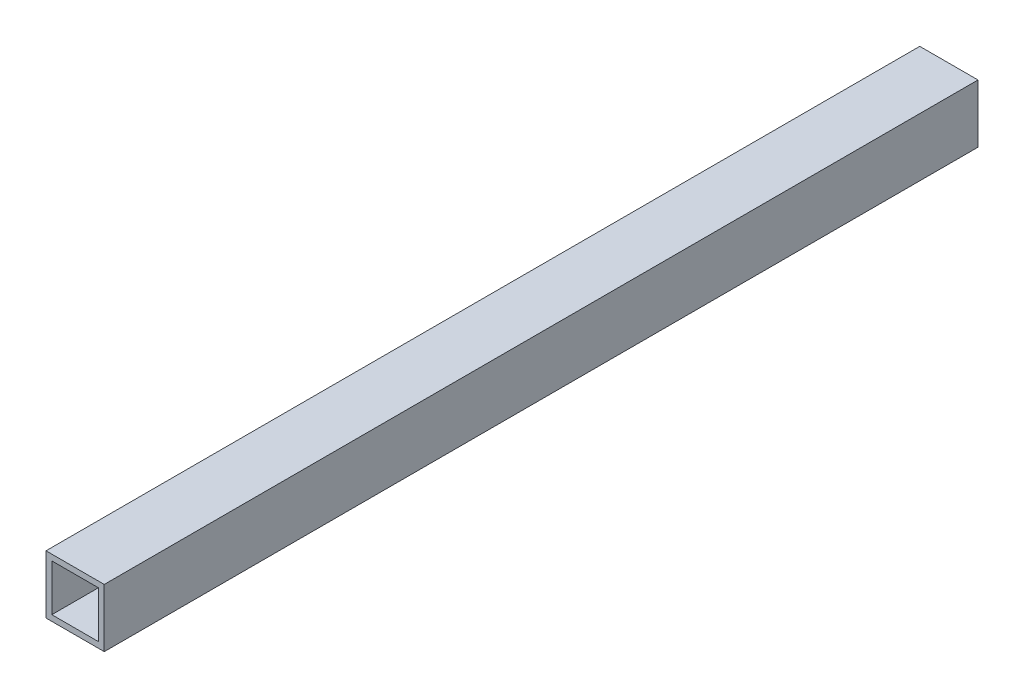
ISO-10303-21;
HEADER;
FILE_DESCRIPTION(('STEP AP214'),'2;1');
FILE_NAME('part.step','',(''),(''),'','','');
FILE_SCHEMA(('AUTOMOTIVE_DESIGN { 1 0 10303 214 1 1 1 1 }'));
ENDSEC;
DATA;
#1=APPLICATION_CONTEXT('core data for automotive mechanical design processes');
#2=APPLICATION_PROTOCOL_DEFINITION('international standard','automotive_design',2000,#1);
#3=PRODUCT_CONTEXT('',#1,'mechanical');
#4=PRODUCT('Part','Part','',(#3));
#5=PRODUCT_RELATED_PRODUCT_CATEGORY('part','',(#4));
#6=PRODUCT_DEFINITION_FORMATION('','',#4);
#7=PRODUCT_DEFINITION_CONTEXT('part definition',#1,'design');
#8=PRODUCT_DEFINITION('design','',#6,#7);
#9=PRODUCT_DEFINITION_SHAPE('','',#8);
#10=(LENGTH_UNIT() NAMED_UNIT(*) SI_UNIT(.MILLI.,.METRE.));
#11=(NAMED_UNIT(*) PLANE_ANGLE_UNIT() SI_UNIT($,.RADIAN.));
#12=(NAMED_UNIT(*) SI_UNIT($,.STERADIAN.) SOLID_ANGLE_UNIT());
#13=UNCERTAINTY_MEASURE_WITH_UNIT(LENGTH_MEASURE(1.E-05),#10,'distance_accuracy_value','');
#14=(GEOMETRIC_REPRESENTATION_CONTEXT(3) GLOBAL_UNCERTAINTY_ASSIGNED_CONTEXT((#13)) GLOBAL_UNIT_ASSIGNED_CONTEXT((#10,
#11,#12)) REPRESENTATION_CONTEXT('',''));
#15=CARTESIAN_POINT('',(0.,0.,0.));
#16=DIRECTION('',(0.,0.,1.));
#17=DIRECTION('',(1.,0.,0.));
#18=AXIS2_PLACEMENT_3D('',#15,#16,#17);
#19=CARTESIAN_POINT('',(0.,0.,150.));
#20=DIRECTION('',(0.,0.,1.));
#21=DIRECTION('',(1.,0.,0.));
#22=AXIS2_PLACEMENT_3D('',#19,#20,#21);
#23=PLANE('',#22);
#24=DIRECTION('',(0.,1.,0.));
#25=VECTOR('',#24,1.);
#26=CARTESIAN_POINT('',(5.,5.,150.));
#27=LINE('',#26,#25);
#28=CARTESIAN_POINT('',(5.,-5.,150.));
#29=VERTEX_POINT('',#28);
#30=CARTESIAN_POINT('',(5.,5.,150.));
#31=VERTEX_POINT('',#30);
#32=EDGE_CURVE('E153',#29,#31,#27,.T.);
#33=ORIENTED_EDGE('',*,*,#32,.T.);
#34=DIRECTION('',(-1.,0.,0.));
#35=VECTOR('',#34,1.);
#36=CARTESIAN_POINT('',(-5.,5.,150.));
#37=LINE('',#36,#35);
#38=CARTESIAN_POINT('',(-5.,5.,150.));
#39=VERTEX_POINT('',#38);
#40=EDGE_CURVE('E157',#31,#39,#37,.T.);
#41=ORIENTED_EDGE('',*,*,#40,.T.);
#42=DIRECTION('',(0.,-1.,0.));
#43=VECTOR('',#42,1.);
#44=CARTESIAN_POINT('',(-5.,5.,150.));
#45=LINE('',#44,#43);
#46=CARTESIAN_POINT('',(-5.,-5.,150.));
#47=VERTEX_POINT('',#46);
#48=EDGE_CURVE('E161',#39,#47,#45,.T.);
#49=ORIENTED_EDGE('',*,*,#48,.T.);
#50=DIRECTION('',(1.,0.,0.));
#51=VECTOR('',#50,1.);
#52=CARTESIAN_POINT('',(-5.,-5.,150.));
#53=LINE('',#52,#51);
#54=EDGE_CURVE('E164',#47,#29,#53,.T.);
#55=ORIENTED_EDGE('',*,*,#54,.T.);
#56=EDGE_LOOP('',(#33,#41,#49,#55));
#57=FACE_BOUND('',#56,.T.);
#58=DIRECTION('',(-1.,0.,0.));
#59=VECTOR('',#58,1.);
#60=CARTESIAN_POINT('',(-4.,4.,150.));
#61=LINE('',#60,#59);
#62=CARTESIAN_POINT('',(4.,4.,150.));
#63=VERTEX_POINT('',#62);
#64=CARTESIAN_POINT('',(-4.,4.,150.));
#65=VERTEX_POINT('',#64);
#66=EDGE_CURVE('E114',#63,#65,#61,.T.);
#67=ORIENTED_EDGE('',*,*,#66,.F.);
#68=DIRECTION('',(0.,1.,0.));
#69=VECTOR('',#68,1.);
#70=CARTESIAN_POINT('',(4.,4.,150.));
#71=LINE('',#70,#69);
#72=CARTESIAN_POINT('',(4.,-4.,150.));
#73=VERTEX_POINT('',#72);
#74=EDGE_CURVE('E105',#73,#63,#71,.T.);
#75=ORIENTED_EDGE('',*,*,#74,.F.);
#76=DIRECTION('',(1.,0.,0.));
#77=VECTOR('',#76,1.);
#78=CARTESIAN_POINT('',(-4.,-4.,150.));
#79=LINE('',#78,#77);
#80=CARTESIAN_POINT('',(-4.,-4.,150.));
#81=VERTEX_POINT('',#80);
#82=EDGE_CURVE('E131',#81,#73,#79,.T.);
#83=ORIENTED_EDGE('',*,*,#82,.F.);
#84=DIRECTION('',(0.,-1.,0.));
#85=VECTOR('',#84,1.);
#86=CARTESIAN_POINT('',(-4.,4.,150.));
#87=LINE('',#86,#85);
#88=EDGE_CURVE('E127',#65,#81,#87,.T.);
#89=ORIENTED_EDGE('',*,*,#88,.F.);
#90=EDGE_LOOP('',(#67,#75,#83,#89));
#91=FACE_BOUND('',#90,.T.);
#92=ADVANCED_FACE('F39',(#57,#91),#23,.T.);
#93=CARTESIAN_POINT('',(0.,0.,0.));
#94=DIRECTION('',(0.,0.,1.));
#95=DIRECTION('',(1.,0.,0.));
#96=AXIS2_PLACEMENT_3D('',#93,#94,#95);
#97=PLANE('',#96);
#98=DIRECTION('',(0.,1.,0.));
#99=VECTOR('',#98,1.);
#100=CARTESIAN_POINT('',(5.,5.,0.));
#101=LINE('',#100,#99);
#102=CARTESIAN_POINT('',(5.,-5.,0.));
#103=VERTEX_POINT('',#102);
#104=CARTESIAN_POINT('',(5.,5.,0.));
#105=VERTEX_POINT('',#104);
#106=EDGE_CURVE('E123',#103,#105,#101,.T.);
#107=ORIENTED_EDGE('',*,*,#106,.F.);
#108=DIRECTION('',(1.,0.,0.));
#109=VECTOR('',#108,1.);
#110=CARTESIAN_POINT('',(-5.,-5.,0.));
#111=LINE('',#110,#109);
#112=CARTESIAN_POINT('',(-5.,-5.,0.));
#113=VERTEX_POINT('',#112);
#114=EDGE_CURVE('E158',#113,#103,#111,.T.);
#115=ORIENTED_EDGE('',*,*,#114,.F.);
#116=DIRECTION('',(0.,-1.,0.));
#117=VECTOR('',#116,1.);
#118=CARTESIAN_POINT('',(-5.,5.,0.));
#119=LINE('',#118,#117);
#120=CARTESIAN_POINT('',(-5.,5.,0.));
#121=VERTEX_POINT('',#120);
#122=EDGE_CURVE('E174',#121,#113,#119,.T.);
#123=ORIENTED_EDGE('',*,*,#122,.F.);
#124=DIRECTION('',(-1.,0.,0.));
#125=VECTOR('',#124,1.);
#126=CARTESIAN_POINT('',(-5.,5.,0.));
#127=LINE('',#126,#125);
#128=EDGE_CURVE('E171',#105,#121,#127,.T.);
#129=ORIENTED_EDGE('',*,*,#128,.F.);
#130=EDGE_LOOP('',(#107,#115,#123,#129));
#131=FACE_BOUND('',#130,.T.);
#132=DIRECTION('',(0.,1.,0.));
#133=VECTOR('',#132,1.);
#134=CARTESIAN_POINT('',(4.,4.,0.));
#135=LINE('',#134,#133);
#136=CARTESIAN_POINT('',(4.,-4.,0.));
#137=VERTEX_POINT('',#136);
#138=CARTESIAN_POINT('',(4.,4.,0.));
#139=VERTEX_POINT('',#138);
#140=EDGE_CURVE('E63',#137,#139,#135,.T.);
#141=ORIENTED_EDGE('',*,*,#140,.T.);
#142=DIRECTION('',(-1.,0.,0.));
#143=VECTOR('',#142,1.);
#144=CARTESIAN_POINT('',(-4.,4.,0.));
#145=LINE('',#144,#143);
#146=CARTESIAN_POINT('',(-4.,4.,0.));
#147=VERTEX_POINT('',#146);
#148=EDGE_CURVE('E121',#139,#147,#145,.T.);
#149=ORIENTED_EDGE('',*,*,#148,.T.);
#150=DIRECTION('',(0.,-1.,0.));
#151=VECTOR('',#150,1.);
#152=CARTESIAN_POINT('',(-4.,4.,0.));
#153=LINE('',#152,#151);
#154=CARTESIAN_POINT('',(-4.,-4.,0.));
#155=VERTEX_POINT('',#154);
#156=EDGE_CURVE('E140',#147,#155,#153,.T.);
#157=ORIENTED_EDGE('',*,*,#156,.T.);
#158=DIRECTION('',(1.,0.,0.));
#159=VECTOR('',#158,1.);
#160=CARTESIAN_POINT('',(-4.,-4.,0.));
#161=LINE('',#160,#159);
#162=EDGE_CURVE('E115',#155,#137,#161,.T.);
#163=ORIENTED_EDGE('',*,*,#162,.T.);
#164=EDGE_LOOP('',(#141,#149,#157,#163));
#165=FACE_BOUND('',#164,.T.);
#166=ADVANCED_FACE('F197',(#131,#165),#97,.F.);
#167=CARTESIAN_POINT('',(5.,5.,150.));
#168=DIRECTION('',(-1.,0.,0.));
#169=DIRECTION('',(0.,-1.,0.));
#170=AXIS2_PLACEMENT_3D('',#167,#168,#169);
#171=PLANE('',#170);
#172=ORIENTED_EDGE('',*,*,#106,.T.);
#173=DIRECTION('',(0.,0.,-1.));
#174=VECTOR('',#173,1.);
#175=CARTESIAN_POINT('',(5.,5.,150.));
#176=LINE('',#175,#174);
#177=EDGE_CURVE('E11',#31,#105,#176,.T.);
#178=ORIENTED_EDGE('',*,*,#177,.F.);
#179=ORIENTED_EDGE('',*,*,#32,.F.);
#180=DIRECTION('',(0.,0.,-1.));
#181=VECTOR('',#180,1.);
#182=CARTESIAN_POINT('',(5.,-5.,150.));
#183=LINE('',#182,#181);
#184=EDGE_CURVE('E167',#29,#103,#183,.T.);
#185=ORIENTED_EDGE('',*,*,#184,.T.);
#186=EDGE_LOOP('',(#172,#178,#179,#185));
#187=FACE_BOUND('',#186,.T.);
#188=ADVANCED_FACE('F41',(#187),#171,.F.);
#189=CARTESIAN_POINT('',(-5.,5.,150.));
#190=DIRECTION('',(0.,-1.,0.));
#191=DIRECTION('',(0.,0.,-1.));
#192=AXIS2_PLACEMENT_3D('',#189,#190,#191);
#193=PLANE('',#192);
#194=ORIENTED_EDGE('',*,*,#128,.T.);
#195=DIRECTION('',(0.,0.,-1.));
#196=VECTOR('',#195,1.);
#197=CARTESIAN_POINT('',(-5.,5.,150.));
#198=LINE('',#197,#196);
#199=EDGE_CURVE('E48',#39,#121,#198,.T.);
#200=ORIENTED_EDGE('',*,*,#199,.F.);
#201=ORIENTED_EDGE('',*,*,#40,.F.);
#202=ORIENTED_EDGE('',*,*,#177,.T.);
#203=EDGE_LOOP('',(#194,#200,#201,#202));
#204=FACE_BOUND('',#203,.T.);
#205=ADVANCED_FACE('F207',(#204),#193,.F.);
#206=CARTESIAN_POINT('',(-5.,5.,150.));
#207=DIRECTION('',(1.,0.,0.));
#208=DIRECTION('',(0.,1.,0.));
#209=AXIS2_PLACEMENT_3D('',#206,#207,#208);
#210=PLANE('',#209);
#211=ORIENTED_EDGE('',*,*,#122,.T.);
#212=DIRECTION('',(0.,0.,-1.));
#213=VECTOR('',#212,1.);
#214=CARTESIAN_POINT('',(-5.,-5.,150.));
#215=LINE('',#214,#213);
#216=EDGE_CURVE('E182',#47,#113,#215,.T.);
#217=ORIENTED_EDGE('',*,*,#216,.F.);
#218=ORIENTED_EDGE('',*,*,#48,.F.);
#219=ORIENTED_EDGE('',*,*,#199,.T.);
#220=EDGE_LOOP('',(#211,#217,#218,#219));
#221=FACE_BOUND('',#220,.T.);
#222=ADVANCED_FACE('F191',(#221),#210,.F.);
#223=CARTESIAN_POINT('',(-5.,-5.,150.));
#224=DIRECTION('',(0.,1.,0.));
#225=DIRECTION('',(0.,0.,1.));
#226=AXIS2_PLACEMENT_3D('',#223,#224,#225);
#227=PLANE('',#226);
#228=ORIENTED_EDGE('',*,*,#114,.T.);
#229=ORIENTED_EDGE('',*,*,#184,.F.);
#230=ORIENTED_EDGE('',*,*,#54,.F.);
#231=ORIENTED_EDGE('',*,*,#216,.T.);
#232=EDGE_LOOP('',(#228,#229,#230,#231));
#233=FACE_BOUND('',#232,.T.);
#234=ADVANCED_FACE('F201',(#233),#227,.F.);
#235=CARTESIAN_POINT('',(4.,4.,150.));
#236=DIRECTION('',(-1.,0.,0.));
#237=DIRECTION('',(0.,-1.,0.));
#238=AXIS2_PLACEMENT_3D('',#235,#236,#237);
#239=PLANE('',#238);
#240=ORIENTED_EDGE('',*,*,#140,.F.);
#241=DIRECTION('',(0.,0.,-1.));
#242=VECTOR('',#241,1.);
#243=CARTESIAN_POINT('',(4.,-4.,150.));
#244=LINE('',#243,#242);
#245=EDGE_CURVE('E109',#73,#137,#244,.T.);
#246=ORIENTED_EDGE('',*,*,#245,.F.);
#247=ORIENTED_EDGE('',*,*,#74,.T.);
#248=DIRECTION('',(0.,0.,-1.));
#249=VECTOR('',#248,1.);
#250=CARTESIAN_POINT('',(4.,4.,150.));
#251=LINE('',#250,#249);
#252=EDGE_CURVE('E108',#63,#139,#251,.T.);
#253=ORIENTED_EDGE('',*,*,#252,.T.);
#254=EDGE_LOOP('',(#240,#246,#247,#253));
#255=FACE_BOUND('',#254,.T.);
#256=ADVANCED_FACE('F107',(#255),#239,.T.);
#257=CARTESIAN_POINT('',(-4.,4.,150.));
#258=DIRECTION('',(0.,-1.,0.));
#259=DIRECTION('',(0.,0.,-1.));
#260=AXIS2_PLACEMENT_3D('',#257,#258,#259);
#261=PLANE('',#260);
#262=ORIENTED_EDGE('',*,*,#148,.F.);
#263=ORIENTED_EDGE('',*,*,#252,.F.);
#264=ORIENTED_EDGE('',*,*,#66,.T.);
#265=DIRECTION('',(0.,0.,-1.));
#266=VECTOR('',#265,1.);
#267=CARTESIAN_POINT('',(-4.,4.,150.));
#268=LINE('',#267,#266);
#269=EDGE_CURVE('E124',#65,#147,#268,.T.);
#270=ORIENTED_EDGE('',*,*,#269,.T.);
#271=EDGE_LOOP('',(#262,#263,#264,#270));
#272=FACE_BOUND('',#271,.T.);
#273=ADVANCED_FACE('F118',(#272),#261,.T.);
#274=CARTESIAN_POINT('',(-4.,4.,150.));
#275=DIRECTION('',(1.,0.,0.));
#276=DIRECTION('',(0.,1.,0.));
#277=AXIS2_PLACEMENT_3D('',#274,#275,#276);
#278=PLANE('',#277);
#279=ORIENTED_EDGE('',*,*,#156,.F.);
#280=ORIENTED_EDGE('',*,*,#269,.F.);
#281=ORIENTED_EDGE('',*,*,#88,.T.);
#282=DIRECTION('',(0.,0.,-1.));
#283=VECTOR('',#282,1.);
#284=CARTESIAN_POINT('',(-4.,-4.,150.));
#285=LINE('',#284,#283);
#286=EDGE_CURVE('E55',#81,#155,#285,.T.);
#287=ORIENTED_EDGE('',*,*,#286,.T.);
#288=EDGE_LOOP('',(#279,#280,#281,#287));
#289=FACE_BOUND('',#288,.T.);
#290=ADVANCED_FACE('F230',(#289),#278,.T.);
#291=CARTESIAN_POINT('',(-4.,-4.,150.));
#292=DIRECTION('',(0.,1.,0.));
#293=DIRECTION('',(0.,0.,1.));
#294=AXIS2_PLACEMENT_3D('',#291,#292,#293);
#295=PLANE('',#294);
#296=ORIENTED_EDGE('',*,*,#162,.F.);
#297=ORIENTED_EDGE('',*,*,#286,.F.);
#298=ORIENTED_EDGE('',*,*,#82,.T.);
#299=ORIENTED_EDGE('',*,*,#245,.T.);
#300=EDGE_LOOP('',(#296,#297,#298,#299));
#301=FACE_BOUND('',#300,.T.);
#302=ADVANCED_FACE('F234',(#301),#295,.T.);
#303=CLOSED_SHELL('',(#92,#166,#188,#205,#222,#234,#256,#273,#290,#302));
#304=MANIFOLD_SOLID_BREP('B2',#303);
#305=ADVANCED_BREP_SHAPE_REPRESENTATION('',(#18,#304),#14);
#306=SHAPE_DEFINITION_REPRESENTATION(#9,#305);
ENDSEC;
END-ISO-10303-21;
